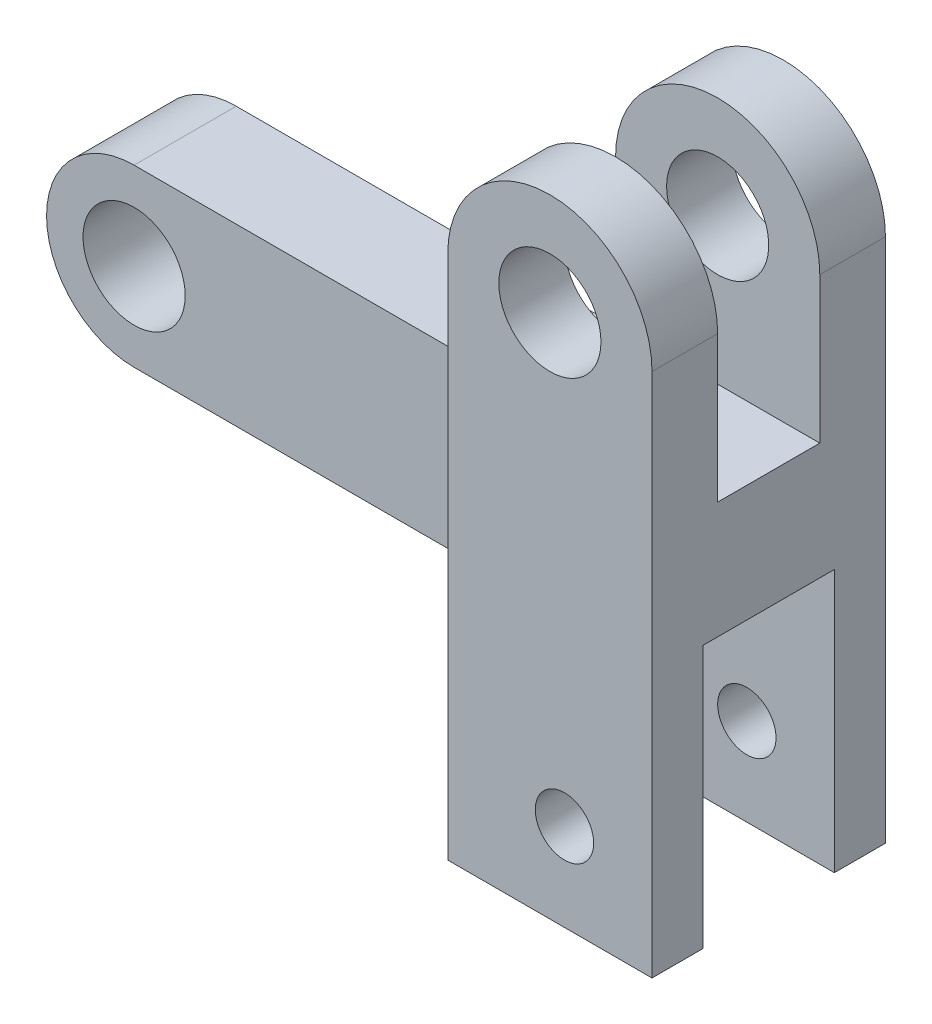
ISO-10303-21;
HEADER;
FILE_DESCRIPTION(('STEP AP214'),'2;1');
FILE_NAME('part.step','',(''),(''),'','','');
FILE_SCHEMA(('AUTOMOTIVE_DESIGN { 1 0 10303 214 1 1 1 1 }'));
ENDSEC;
DATA;
#1=APPLICATION_CONTEXT('core data for automotive mechanical design processes');
#2=APPLICATION_PROTOCOL_DEFINITION('international standard','automotive_design',2000,#1);
#3=PRODUCT_CONTEXT('',#1,'mechanical');
#4=PRODUCT('Part','Part','',(#3));
#5=PRODUCT_RELATED_PRODUCT_CATEGORY('part','',(#4));
#6=PRODUCT_DEFINITION_FORMATION('','',#4);
#7=PRODUCT_DEFINITION_CONTEXT('part definition',#1,'design');
#8=PRODUCT_DEFINITION('design','',#6,#7);
#9=PRODUCT_DEFINITION_SHAPE('','',#8);
#10=(LENGTH_UNIT() NAMED_UNIT(*) SI_UNIT(.MILLI.,.METRE.));
#11=(NAMED_UNIT(*) PLANE_ANGLE_UNIT() SI_UNIT($,.RADIAN.));
#12=(NAMED_UNIT(*) SI_UNIT($,.STERADIAN.) SOLID_ANGLE_UNIT());
#13=UNCERTAINTY_MEASURE_WITH_UNIT(LENGTH_MEASURE(1.E-05),#10,'distance_accuracy_value','');
#14=(GEOMETRIC_REPRESENTATION_CONTEXT(3) GLOBAL_UNCERTAINTY_ASSIGNED_CONTEXT((#13)) GLOBAL_UNIT_ASSIGNED_CONTEXT((#10,
#11,#12)) REPRESENTATION_CONTEXT('',''));
#15=CARTESIAN_POINT('',(0.,0.,0.));
#16=DIRECTION('',(0.,0.,1.));
#17=DIRECTION('',(1.,0.,0.));
#18=AXIS2_PLACEMENT_3D('',#15,#16,#17);
#19=CARTESIAN_POINT('',(0.,2.4,-3.5));
#20=DIRECTION('',(1.,0.,0.));
#21=DIRECTION('',(0.,0.,-1.));
#22=AXIS2_PLACEMENT_3D('',#19,#20,#21);
#23=PLANE('',#22);
#24=DIRECTION('',(0.,-1.,0.));
#25=VECTOR('',#24,1.);
#26=CARTESIAN_POINT('',(0.,1.,2.25));
#27=LINE('',#26,#25);
#28=CARTESIAN_POINT('',(0.,1.,2.25));
#29=VERTEX_POINT('',#28);
#30=CARTESIAN_POINT('',(0.,-8.,2.25));
#31=VERTEX_POINT('',#30);
#32=EDGE_CURVE('E239',#29,#31,#27,.T.);
#33=ORIENTED_EDGE('',*,*,#32,.T.);
#34=DIRECTION('',(0.,0.,-1.));
#35=VECTOR('',#34,1.);
#36=CARTESIAN_POINT('',(0.,-8.,3.5));
#37=LINE('',#36,#35);
#38=CARTESIAN_POINT('',(0.,-8.,4.));
#39=VERTEX_POINT('',#38);
#40=EDGE_CURVE('E278',#39,#31,#37,.T.);
#41=ORIENTED_EDGE('',*,*,#40,.F.);
#42=DIRECTION('',(0.,-1.,0.));
#43=VECTOR('',#42,1.);
#44=CARTESIAN_POINT('',(0.,10.,4.));
#45=LINE('',#44,#43);
#46=CARTESIAN_POINT('',(0.,10.,4.));
#47=VERTEX_POINT('',#46);
#48=EDGE_CURVE('E212',#47,#39,#45,.T.);
#49=ORIENTED_EDGE('',*,*,#48,.F.);
#50=DIRECTION('',(0.,0.,1.));
#51=VECTOR('',#50,1.);
#52=CARTESIAN_POINT('',(0.,10.,1.75));
#53=LINE('',#52,#51);
#54=CARTESIAN_POINT('',(0.,10.,1.75));
#55=VERTEX_POINT('',#54);
#56=EDGE_CURVE('E296',#55,#47,#53,.T.);
#57=ORIENTED_EDGE('',*,*,#56,.F.);
#58=DIRECTION('',(0.,1.,0.));
#59=VECTOR('',#58,1.);
#60=CARTESIAN_POINT('',(0.,0.,1.75));
#61=LINE('',#60,#59);
#62=CARTESIAN_POINT('',(0.,5.,1.75));
#63=VERTEX_POINT('',#62);
#64=EDGE_CURVE('E285',#63,#55,#61,.T.);
#65=ORIENTED_EDGE('',*,*,#64,.F.);
#66=CARTESIAN_POINT('',(0.,1.,1.75));
#67=VERTEX_POINT('',#66);
#68=EDGE_CURVE('E290',#67,#63,#61,.T.);
#69=ORIENTED_EDGE('',*,*,#68,.F.);
#70=DIRECTION('',(0.,0.,1.));
#71=VECTOR('',#70,1.);
#72=CARTESIAN_POINT('',(0.,1.,2.25));
#73=LINE('',#72,#71);
#74=EDGE_CURVE('E221',#67,#29,#73,.T.);
#75=ORIENTED_EDGE('',*,*,#74,.T.);
#76=EDGE_LOOP('',(#33,#41,#49,#57,#65,#69,#75));
#77=FACE_BOUND('',#76,.T.);
#78=ADVANCED_FACE('F45',(#77),#23,.F.);
#79=DIRECTION('',(0.,-1.,0.));
#80=VECTOR('',#79,1.);
#81=CARTESIAN_POINT('',(0.,1.,-2.25));
#82=LINE('',#81,#80);
#83=CARTESIAN_POINT('',(0.,1.,-2.25));
#84=VERTEX_POINT('',#83);
#85=CARTESIAN_POINT('',(0.,-8.,-2.25));
#86=VERTEX_POINT('',#85);
#87=EDGE_CURVE('E228',#84,#86,#82,.T.);
#88=ORIENTED_EDGE('',*,*,#87,.F.);
#89=CARTESIAN_POINT('',(0.,1.,-1.75));
#90=VERTEX_POINT('',#89);
#91=EDGE_CURVE('E216',#84,#90,#73,.T.);
#92=ORIENTED_EDGE('',*,*,#91,.T.);
#93=DIRECTION('',(0.,1.,0.));
#94=VECTOR('',#93,1.);
#95=CARTESIAN_POINT('',(0.,0.,-1.75));
#96=LINE('',#95,#94);
#97=CARTESIAN_POINT('',(0.,5.,-1.75));
#98=VERTEX_POINT('',#97);
#99=EDGE_CURVE('E301',#90,#98,#96,.T.);
#100=ORIENTED_EDGE('',*,*,#99,.T.);
#101=CARTESIAN_POINT('',(0.,10.,-1.75));
#102=VERTEX_POINT('',#101);
#103=EDGE_CURVE('E298',#98,#102,#96,.T.);
#104=ORIENTED_EDGE('',*,*,#103,.T.);
#105=DIRECTION('',(0.,0.,-1.));
#106=VECTOR('',#105,1.);
#107=CARTESIAN_POINT('',(0.,10.,-1.75));
#108=LINE('',#107,#106);
#109=CARTESIAN_POINT('',(0.,10.,-4.));
#110=VERTEX_POINT('',#109);
#111=EDGE_CURVE('E169',#102,#110,#108,.T.);
#112=ORIENTED_EDGE('',*,*,#111,.T.);
#113=DIRECTION('',(0.,1.,0.));
#114=VECTOR('',#113,1.);
#115=CARTESIAN_POINT('',(0.,-8.,-4.));
#116=LINE('',#115,#114);
#117=CARTESIAN_POINT('',(0.,-8.,-4.));
#118=VERTEX_POINT('',#117);
#119=EDGE_CURVE('E187',#118,#110,#116,.T.);
#120=ORIENTED_EDGE('',*,*,#119,.F.);
#121=EDGE_CURVE('E277',#86,#118,#37,.T.);
#122=ORIENTED_EDGE('',*,*,#121,.F.);
#123=EDGE_LOOP('',(#88,#92,#100,#104,#112,#120,#122));
#124=FACE_BOUND('',#123,.T.);
#125=ADVANCED_FACE('F368',(#124),#23,.F.);
#126=CARTESIAN_POINT('',(7.,2.4,-3.5));
#127=DIRECTION('',(-1.,0.,0.));
#128=DIRECTION('',(0.,0.,1.));
#129=AXIS2_PLACEMENT_3D('',#126,#127,#128);
#130=PLANE('',#129);
#131=DIRECTION('',(0.,-1.,0.));
#132=VECTOR('',#131,1.);
#133=CARTESIAN_POINT('',(7.,1.,2.25));
#134=LINE('',#133,#132);
#135=CARTESIAN_POINT('',(7.,1.,2.25));
#136=VERTEX_POINT('',#135);
#137=CARTESIAN_POINT('',(7.,-8.,2.25));
#138=VERTEX_POINT('',#137);
#139=EDGE_CURVE('E237',#136,#138,#134,.T.);
#140=ORIENTED_EDGE('',*,*,#139,.F.);
#141=DIRECTION('',(0.,0.,-1.));
#142=VECTOR('',#141,1.);
#143=CARTESIAN_POINT('',(7.,1.,2.25));
#144=LINE('',#143,#142);
#145=CARTESIAN_POINT('',(7.,1.,-2.25));
#146=VERTEX_POINT('',#145);
#147=EDGE_CURVE('E223',#136,#146,#144,.T.);
#148=ORIENTED_EDGE('',*,*,#147,.T.);
#149=DIRECTION('',(0.,-1.,0.));
#150=VECTOR('',#149,1.);
#151=CARTESIAN_POINT('',(7.,1.,-2.25));
#152=LINE('',#151,#150);
#153=CARTESIAN_POINT('',(7.,-8.,-2.25));
#154=VERTEX_POINT('',#153);
#155=EDGE_CURVE('E235',#146,#154,#152,.T.);
#156=ORIENTED_EDGE('',*,*,#155,.T.);
#157=DIRECTION('',(0.,0.,1.));
#158=VECTOR('',#157,1.);
#159=CARTESIAN_POINT('',(7.,-8.,-3.5));
#160=LINE('',#159,#158);
#161=CARTESIAN_POINT('',(7.,-8.,-4.));
#162=VERTEX_POINT('',#161);
#163=EDGE_CURVE('E177',#162,#154,#160,.T.);
#164=ORIENTED_EDGE('',*,*,#163,.F.);
#165=DIRECTION('',(0.,-1.,0.));
#166=VECTOR('',#165,1.);
#167=CARTESIAN_POINT('',(7.,10.,-4.));
#168=LINE('',#167,#166);
#169=CARTESIAN_POINT('',(7.,10.,-4.));
#170=VERTEX_POINT('',#169);
#171=EDGE_CURVE('E172',#170,#162,#168,.T.);
#172=ORIENTED_EDGE('',*,*,#171,.F.);
#173=DIRECTION('',(0.,0.,-1.));
#174=VECTOR('',#173,1.);
#175=CARTESIAN_POINT('',(7.,10.,-1.75));
#176=LINE('',#175,#174);
#177=CARTESIAN_POINT('',(7.,10.,-1.75));
#178=VERTEX_POINT('',#177);
#179=EDGE_CURVE('E53',#178,#170,#176,.T.);
#180=ORIENTED_EDGE('',*,*,#179,.F.);
#181=DIRECTION('',(0.,-1.,0.));
#182=VECTOR('',#181,1.);
#183=CARTESIAN_POINT('',(7.,0.,-1.75));
#184=LINE('',#183,#182);
#185=CARTESIAN_POINT('',(7.,5.,-1.75));
#186=VERTEX_POINT('',#185);
#187=EDGE_CURVE('E303',#178,#186,#184,.T.);
#188=ORIENTED_EDGE('',*,*,#187,.T.);
#189=DIRECTION('',(0.,0.,-1.));
#190=VECTOR('',#189,1.);
#191=CARTESIAN_POINT('',(7.,5.,1.75));
#192=LINE('',#191,#190);
#193=CARTESIAN_POINT('',(7.,5.,1.75));
#194=VERTEX_POINT('',#193);
#195=EDGE_CURVE('E269',#194,#186,#192,.T.);
#196=ORIENTED_EDGE('',*,*,#195,.F.);
#197=DIRECTION('',(0.,-1.,0.));
#198=VECTOR('',#197,1.);
#199=CARTESIAN_POINT('',(7.,0.,1.75));
#200=LINE('',#199,#198);
#201=CARTESIAN_POINT('',(7.,10.,1.75));
#202=VERTEX_POINT('',#201);
#203=EDGE_CURVE('E292',#202,#194,#200,.T.);
#204=ORIENTED_EDGE('',*,*,#203,.F.);
#205=DIRECTION('',(0.,0.,1.));
#206=VECTOR('',#205,1.);
#207=CARTESIAN_POINT('',(7.,10.,1.75));
#208=LINE('',#207,#206);
#209=CARTESIAN_POINT('',(7.,10.,4.));
#210=VERTEX_POINT('',#209);
#211=EDGE_CURVE('E294',#202,#210,#208,.T.);
#212=ORIENTED_EDGE('',*,*,#211,.T.);
#213=DIRECTION('',(0.,1.,0.));
#214=VECTOR('',#213,1.);
#215=CARTESIAN_POINT('',(7.,-8.,4.));
#216=LINE('',#215,#214);
#217=CARTESIAN_POINT('',(7.,-8.,4.));
#218=VERTEX_POINT('',#217);
#219=EDGE_CURVE('E206',#218,#210,#216,.T.);
#220=ORIENTED_EDGE('',*,*,#219,.F.);
#221=EDGE_CURVE('E275',#138,#218,#160,.T.);
#222=ORIENTED_EDGE('',*,*,#221,.F.);
#223=EDGE_LOOP('',(#140,#148,#156,#164,#172,#180,#188,#196,#204,#212,#220,#222));
#224=FACE_BOUND('',#223,.T.);
#225=ADVANCED_FACE('F174',(#224),#130,.F.);
#226=CARTESIAN_POINT('',(0.,-8.,0.));
#227=DIRECTION('',(0.,-1.,0.));
#228=DIRECTION('',(0.,0.,-1.));
#229=AXIS2_PLACEMENT_3D('',#226,#227,#228);
#230=PLANE('',#229);
#231=ORIENTED_EDGE('',*,*,#40,.T.);
#232=DIRECTION('',(1.,0.,0.));
#233=VECTOR('',#232,1.);
#234=CARTESIAN_POINT('',(0.,-8.,2.25));
#235=LINE('',#234,#233);
#236=EDGE_CURVE('E215',#31,#138,#235,.T.);
#237=ORIENTED_EDGE('',*,*,#236,.T.);
#238=ORIENTED_EDGE('',*,*,#221,.T.);
#239=DIRECTION('',(1.,0.,0.));
#240=VECTOR('',#239,1.);
#241=CARTESIAN_POINT('',(0.,-8.,4.));
#242=LINE('',#241,#240);
#243=EDGE_CURVE('E203',#39,#218,#242,.T.);
#244=ORIENTED_EDGE('',*,*,#243,.F.);
#245=EDGE_LOOP('',(#231,#237,#238,#244));
#246=FACE_BOUND('',#245,.T.);
#247=ADVANCED_FACE('F330',(#246),#230,.T.);
#248=ORIENTED_EDGE('',*,*,#163,.T.);
#249=DIRECTION('',(-1.,0.,0.));
#250=VECTOR('',#249,1.);
#251=CARTESIAN_POINT('',(0.,-8.,-2.25));
#252=LINE('',#251,#250);
#253=EDGE_CURVE('E231',#154,#86,#252,.T.);
#254=ORIENTED_EDGE('',*,*,#253,.T.);
#255=ORIENTED_EDGE('',*,*,#121,.T.);
#256=DIRECTION('',(-1.,0.,0.));
#257=VECTOR('',#256,1.);
#258=CARTESIAN_POINT('',(7.,-8.,-4.));
#259=LINE('',#258,#257);
#260=EDGE_CURVE('E181',#162,#118,#259,.T.);
#261=ORIENTED_EDGE('',*,*,#260,.F.);
#262=EDGE_LOOP('',(#248,#254,#255,#261));
#263=FACE_BOUND('',#262,.T.);
#264=ADVANCED_FACE('F379',(#263),#230,.T.);
#265=CARTESIAN_POINT('',(4.,-5.,-3.5));
#266=DIRECTION('',(0.,0.,1.));
#267=DIRECTION('',(1.,0.,0.));
#268=AXIS2_PLACEMENT_3D('',#265,#266,#267);
#269=CYLINDRICAL_SURFACE('',#268,1.);
#270=CARTESIAN_POINT('',(4.,-5.,2.25));
#271=DIRECTION('',(0.,0.,-1.));
#272=DIRECTION('',(-1.,0.,0.));
#273=AXIS2_PLACEMENT_3D('',#270,#271,#272);
#274=CIRCLE('',#273,1.);
#275=CARTESIAN_POINT('',(3.,-5.,2.25));
#276=VERTEX_POINT('',#275);
#277=EDGE_CURVE('E48',#276,#276,#274,.T.);
#278=ORIENTED_EDGE('',*,*,#277,.T.);
#279=EDGE_LOOP('',(#278));
#280=FACE_BOUND('',#279,.T.);
#281=CARTESIAN_POINT('',(4.,-5.,4.));
#282=DIRECTION('',(0.,0.,1.));
#283=DIRECTION('',(1.,0.,0.));
#284=AXIS2_PLACEMENT_3D('',#281,#282,#283);
#285=CIRCLE('',#284,1.);
#286=CARTESIAN_POINT('',(5.,-5.,4.));
#287=VERTEX_POINT('',#286);
#288=EDGE_CURVE('E200',#287,#287,#285,.T.);
#289=ORIENTED_EDGE('',*,*,#288,.T.);
#290=EDGE_LOOP('',(#289));
#291=FACE_BOUND('',#290,.T.);
#292=ADVANCED_FACE('F313',(#280,#291),#269,.F.);
#293=CARTESIAN_POINT('',(4.,-5.,-2.25));
#294=DIRECTION('',(0.,0.,1.));
#295=DIRECTION('',(1.,0.,0.));
#296=AXIS2_PLACEMENT_3D('',#293,#294,#295);
#297=CIRCLE('',#296,1.);
#298=CARTESIAN_POINT('',(5.,-5.,-2.25));
#299=VERTEX_POINT('',#298);
#300=EDGE_CURVE('E242',#299,#299,#297,.T.);
#301=ORIENTED_EDGE('',*,*,#300,.T.);
#302=EDGE_LOOP('',(#301));
#303=FACE_BOUND('',#302,.T.);
#304=CARTESIAN_POINT('',(4.,-5.,-4.));
#305=DIRECTION('',(0.,0.,-1.));
#306=DIRECTION('',(-1.,0.,0.));
#307=AXIS2_PLACEMENT_3D('',#304,#305,#306);
#308=CIRCLE('',#307,0.999999999999997);
#309=CARTESIAN_POINT('',(3.,-5.,-4.));
#310=VERTEX_POINT('',#309);
#311=EDGE_CURVE('E188',#310,#310,#308,.T.);
#312=ORIENTED_EDGE('',*,*,#311,.T.);
#313=EDGE_LOOP('',(#312));
#314=FACE_BOUND('',#313,.T.);
#315=ADVANCED_FACE('F387',(#303,#314),#269,.F.);
#316=CARTESIAN_POINT('',(3.5,10.,-1.75));
#317=DIRECTION('',(0.,0.,-1.));
#318=DIRECTION('',(-1.,0.,0.));
#319=AXIS2_PLACEMENT_3D('',#316,#317,#318);
#320=CYLINDRICAL_SURFACE('',#319,3.5);
#321=ORIENTED_EDGE('',*,*,#179,.T.);
#322=CARTESIAN_POINT('',(3.5,10.,-4.));
#323=DIRECTION('',(0.,0.,-1.));
#324=DIRECTION('',(-1.,0.,0.));
#325=AXIS2_PLACEMENT_3D('',#322,#323,#324);
#326=CIRCLE('',#325,3.5);
#327=EDGE_CURVE('E165',#110,#170,#326,.T.);
#328=ORIENTED_EDGE('',*,*,#327,.F.);
#329=ORIENTED_EDGE('',*,*,#111,.F.);
#330=CARTESIAN_POINT('',(3.5,10.,-1.75));
#331=DIRECTION('',(0.,0.,-1.));
#332=DIRECTION('',(-1.,0.,0.));
#333=AXIS2_PLACEMENT_3D('',#330,#331,#332);
#334=CIRCLE('',#333,3.5);
#335=EDGE_CURVE('E167',#102,#178,#334,.T.);
#336=ORIENTED_EDGE('',*,*,#335,.T.);
#337=EDGE_LOOP('',(#321,#328,#329,#336));
#338=FACE_BOUND('',#337,.T.);
#339=ADVANCED_FACE('F162',(#338),#320,.T.);
#340=CARTESIAN_POINT('',(0.,0.,-1.75));
#341=DIRECTION('',(0.,0.,-1.));
#342=DIRECTION('',(-1.,0.,0.));
#343=AXIS2_PLACEMENT_3D('',#340,#341,#342);
#344=PLANE('',#343);
#345=CARTESIAN_POINT('',(3.5,10.,-1.75));
#346=DIRECTION('',(0.,0.,-1.));
#347=DIRECTION('',(-1.,0.,0.));
#348=AXIS2_PLACEMENT_3D('',#345,#346,#347);
#349=CIRCLE('',#348,1.75);
#350=CARTESIAN_POINT('',(1.75,10.,-1.75));
#351=VERTEX_POINT('',#350);
#352=EDGE_CURVE('E282',#351,#351,#349,.T.);
#353=ORIENTED_EDGE('',*,*,#352,.T.);
#354=EDGE_LOOP('',(#353));
#355=FACE_BOUND('',#354,.T.);
#356=ORIENTED_EDGE('',*,*,#103,.F.);
#357=DIRECTION('',(1.,0.,0.));
#358=VECTOR('',#357,1.);
#359=CARTESIAN_POINT('',(0.,5.,-1.75));
#360=LINE('',#359,#358);
#361=EDGE_CURVE('E69',#98,#186,#360,.T.);
#362=ORIENTED_EDGE('',*,*,#361,.T.);
#363=ORIENTED_EDGE('',*,*,#187,.F.);
#364=ORIENTED_EDGE('',*,*,#335,.F.);
#365=EDGE_LOOP('',(#356,#362,#363,#364));
#366=FACE_BOUND('',#365,.T.);
#367=ADVANCED_FACE('F369',(#355,#366),#344,.F.);
#368=CARTESIAN_POINT('',(3.5,10.,1.75));
#369=DIRECTION('',(0.,0.,1.));
#370=DIRECTION('',(1.,0.,0.));
#371=AXIS2_PLACEMENT_3D('',#368,#369,#370);
#372=CYLINDRICAL_SURFACE('',#371,3.5);
#373=ORIENTED_EDGE('',*,*,#56,.T.);
#374=CARTESIAN_POINT('',(3.5,10.,4.));
#375=DIRECTION('',(0.,0.,1.));
#376=DIRECTION('',(1.,0.,0.));
#377=AXIS2_PLACEMENT_3D('',#374,#375,#376);
#378=CIRCLE('',#377,3.5);
#379=EDGE_CURVE('E209',#210,#47,#378,.T.);
#380=ORIENTED_EDGE('',*,*,#379,.F.);
#381=ORIENTED_EDGE('',*,*,#211,.F.);
#382=CARTESIAN_POINT('',(3.5,10.,1.75));
#383=DIRECTION('',(0.,0.,-1.));
#384=DIRECTION('',(-1.,0.,0.));
#385=AXIS2_PLACEMENT_3D('',#382,#383,#384);
#386=CIRCLE('',#385,3.5);
#387=EDGE_CURVE('E289',#55,#202,#386,.T.);
#388=ORIENTED_EDGE('',*,*,#387,.F.);
#389=EDGE_LOOP('',(#373,#380,#381,#388));
#390=FACE_BOUND('',#389,.T.);
#391=ADVANCED_FACE('F340',(#390),#372,.T.);
#392=CARTESIAN_POINT('',(0.,0.,1.75));
#393=DIRECTION('',(0.,0.,-1.));
#394=DIRECTION('',(-1.,0.,0.));
#395=AXIS2_PLACEMENT_3D('',#392,#393,#394);
#396=PLANE('',#395);
#397=DIRECTION('',(1.,0.,0.));
#398=VECTOR('',#397,1.);
#399=CARTESIAN_POINT('',(0.,5.,1.75));
#400=LINE('',#399,#398);
#401=EDGE_CURVE('E12',#63,#194,#400,.T.);
#402=ORIENTED_EDGE('',*,*,#401,.F.);
#403=ORIENTED_EDGE('',*,*,#64,.T.);
#404=ORIENTED_EDGE('',*,*,#387,.T.);
#405=ORIENTED_EDGE('',*,*,#203,.T.);
#406=EDGE_LOOP('',(#402,#403,#404,#405));
#407=FACE_BOUND('',#406,.T.);
#408=CARTESIAN_POINT('',(3.5,10.,1.75));
#409=DIRECTION('',(0.,0.,-1.));
#410=DIRECTION('',(-1.,0.,0.));
#411=AXIS2_PLACEMENT_3D('',#408,#409,#410);
#412=CIRCLE('',#411,1.75);
#413=CARTESIAN_POINT('',(1.75,10.,1.75));
#414=VERTEX_POINT('',#413);
#415=EDGE_CURVE('E281',#414,#414,#412,.T.);
#416=ORIENTED_EDGE('',*,*,#415,.F.);
#417=EDGE_LOOP('',(#416));
#418=FACE_BOUND('',#417,.T.);
#419=ADVANCED_FACE('F345',(#407,#418),#396,.T.);
#420=CARTESIAN_POINT('',(3.5,10.,3.5));
#421=DIRECTION('',(0.,0.,-1.));
#422=DIRECTION('',(-1.,0.,0.));
#423=AXIS2_PLACEMENT_3D('',#420,#421,#422);
#424=CYLINDRICAL_SURFACE('',#423,1.75);
#425=ORIENTED_EDGE('',*,*,#415,.T.);
#426=EDGE_LOOP('',(#425));
#427=FACE_BOUND('',#426,.T.);
#428=CARTESIAN_POINT('',(3.5,10.,4.));
#429=DIRECTION('',(0.,0.,1.));
#430=DIRECTION('',(1.,0.,0.));
#431=AXIS2_PLACEMENT_3D('',#428,#429,#430);
#432=CIRCLE('',#431,1.75);
#433=CARTESIAN_POINT('',(5.25,10.,4.));
#434=VERTEX_POINT('',#433);
#435=EDGE_CURVE('E197',#434,#434,#432,.T.);
#436=ORIENTED_EDGE('',*,*,#435,.T.);
#437=EDGE_LOOP('',(#436));
#438=FACE_BOUND('',#437,.T.);
#439=ADVANCED_FACE('F411',(#427,#438),#424,.F.);
#440=ORIENTED_EDGE('',*,*,#352,.F.);
#441=EDGE_LOOP('',(#440));
#442=FACE_BOUND('',#441,.T.);
#443=CARTESIAN_POINT('',(3.5,10.,-4.));
#444=DIRECTION('',(0.,0.,-1.));
#445=DIRECTION('',(-1.,0.,0.));
#446=AXIS2_PLACEMENT_3D('',#443,#444,#445);
#447=CIRCLE('',#446,1.75);
#448=CARTESIAN_POINT('',(1.75,10.,-4.));
#449=VERTEX_POINT('',#448);
#450=EDGE_CURVE('E191',#449,#449,#447,.T.);
#451=ORIENTED_EDGE('',*,*,#450,.T.);
#452=EDGE_LOOP('',(#451));
#453=FACE_BOUND('',#452,.T.);
#454=ADVANCED_FACE('F413',(#442,#453),#424,.F.);
#455=CARTESIAN_POINT('',(0.,-0.999999999999999,1.75));
#456=DIRECTION('',(0.,1.,0.));
#457=DIRECTION('',(-1.,0.,0.));
#458=AXIS2_PLACEMENT_3D('',#455,#456,#457);
#459=PLANE('',#458);
#460=DIRECTION('',(1.,0.,0.));
#461=VECTOR('',#460,1.);
#462=CARTESIAN_POINT('',(0.,-0.999999999999999,-1.75));
#463=LINE('',#462,#461);
#464=CARTESIAN_POINT('',(-13.,-1.,-1.75));
#465=VERTEX_POINT('',#464);
#466=CARTESIAN_POINT('',(0.,-1.,-1.75));
#467=VERTEX_POINT('',#466);
#468=EDGE_CURVE('E263',#465,#467,#463,.T.);
#469=ORIENTED_EDGE('',*,*,#468,.T.);
#470=DIRECTION('',(0.,0.,1.));
#471=VECTOR('',#470,1.);
#472=CARTESIAN_POINT('',(0.,-1.,-3.5));
#473=LINE('',#472,#471);
#474=CARTESIAN_POINT('',(0.,-0.999999999999999,1.75));
#475=VERTEX_POINT('',#474);
#476=EDGE_CURVE('E61',#467,#475,#473,.T.);
#477=ORIENTED_EDGE('',*,*,#476,.T.);
#478=DIRECTION('',(1.,0.,0.));
#479=VECTOR('',#478,1.);
#480=CARTESIAN_POINT('',(0.,-0.999999999999999,1.75));
#481=LINE('',#480,#479);
#482=CARTESIAN_POINT('',(-13.,-1.,1.75));
#483=VERTEX_POINT('',#482);
#484=EDGE_CURVE('E250',#483,#475,#481,.T.);
#485=ORIENTED_EDGE('',*,*,#484,.F.);
#486=DIRECTION('',(0.,0.,-1.));
#487=VECTOR('',#486,1.);
#488=CARTESIAN_POINT('',(-13.,-1.,1.75));
#489=LINE('',#488,#487);
#490=EDGE_CURVE('E272',#483,#465,#489,.T.);
#491=ORIENTED_EDGE('',*,*,#490,.T.);
#492=EDGE_LOOP('',(#469,#477,#485,#491));
#493=FACE_BOUND('',#492,.T.);
#494=ADVANCED_FACE('F355',(#493),#459,.F.);
#495=CARTESIAN_POINT('',(0.,0.,1.75));
#496=DIRECTION('',(0.,0.,1.));
#497=DIRECTION('',(1.,0.,0.));
#498=AXIS2_PLACEMENT_3D('',#495,#496,#497);
#499=PLANE('',#498);
#500=CARTESIAN_POINT('',(-13.,2.,1.75));
#501=DIRECTION('',(0.,0.,1.));
#502=DIRECTION('',(1.,0.,0.));
#503=AXIS2_PLACEMENT_3D('',#500,#501,#502);
#504=CIRCLE('',#503,1.75);
#505=CARTESIAN_POINT('',(-11.25,2.,1.75));
#506=VERTEX_POINT('',#505);
#507=EDGE_CURVE('E243',#506,#506,#504,.T.);
#508=ORIENTED_EDGE('',*,*,#507,.F.);
#509=EDGE_LOOP('',(#508));
#510=FACE_BOUND('',#509,.T.);
#511=EDGE_CURVE('E286',#475,#67,#61,.T.);
#512=ORIENTED_EDGE('',*,*,#511,.T.);
#513=ORIENTED_EDGE('',*,*,#68,.T.);
#514=DIRECTION('',(1.,0.,0.));
#515=VECTOR('',#514,1.);
#516=CARTESIAN_POINT('',(0.,5.,1.75));
#517=LINE('',#516,#515);
#518=CARTESIAN_POINT('',(-13.,5.,1.75));
#519=VERTEX_POINT('',#518);
#520=EDGE_CURVE('E253',#519,#63,#517,.T.);
#521=ORIENTED_EDGE('',*,*,#520,.F.);
#522=CARTESIAN_POINT('',(-13.,2.,1.75));
#523=DIRECTION('',(0.,0.,1.));
#524=DIRECTION('',(1.,0.,0.));
#525=AXIS2_PLACEMENT_3D('',#522,#523,#524);
#526=CIRCLE('',#525,3.);
#527=EDGE_CURVE('E246',#483,#519,#526,.F.);
#528=ORIENTED_EDGE('',*,*,#527,.F.);
#529=ORIENTED_EDGE('',*,*,#484,.T.);
#530=EDGE_LOOP('',(#512,#513,#521,#528,#529));
#531=FACE_BOUND('',#530,.T.);
#532=ADVANCED_FACE('F349',(#510,#531),#499,.T.);
#533=CARTESIAN_POINT('',(0.,0.,-1.75));
#534=DIRECTION('',(0.,0.,1.));
#535=DIRECTION('',(1.,0.,0.));
#536=AXIS2_PLACEMENT_3D('',#533,#534,#535);
#537=PLANE('',#536);
#538=CARTESIAN_POINT('',(-13.,2.,-1.75));
#539=DIRECTION('',(0.,0.,1.));
#540=DIRECTION('',(1.,0.,0.));
#541=AXIS2_PLACEMENT_3D('',#538,#539,#540);
#542=CIRCLE('',#541,1.75);
#543=CARTESIAN_POINT('',(-11.25,2.,-1.75));
#544=VERTEX_POINT('',#543);
#545=EDGE_CURVE('E257',#544,#544,#542,.T.);
#546=ORIENTED_EDGE('',*,*,#545,.T.);
#547=EDGE_LOOP('',(#546));
#548=FACE_BOUND('',#547,.T.);
#549=CARTESIAN_POINT('',(-13.,5.,-1.75));
#550=VERTEX_POINT('',#549);
#551=EDGE_CURVE('E247',#550,#98,#360,.T.);
#552=ORIENTED_EDGE('',*,*,#551,.T.);
#553=ORIENTED_EDGE('',*,*,#99,.F.);
#554=EDGE_CURVE('E299',#467,#90,#96,.T.);
#555=ORIENTED_EDGE('',*,*,#554,.F.);
#556=ORIENTED_EDGE('',*,*,#468,.F.);
#557=CARTESIAN_POINT('',(-13.,2.,-1.75));
#558=DIRECTION('',(0.,0.,1.));
#559=DIRECTION('',(1.,0.,0.));
#560=AXIS2_PLACEMENT_3D('',#557,#558,#559);
#561=CIRCLE('',#560,3.);
#562=EDGE_CURVE('E260',#465,#550,#561,.F.);
#563=ORIENTED_EDGE('',*,*,#562,.T.);
#564=EDGE_LOOP('',(#552,#553,#555,#556,#563));
#565=FACE_BOUND('',#564,.T.);
#566=ADVANCED_FACE('F359',(#548,#565),#537,.F.);
#567=CARTESIAN_POINT('',(-13.,2.,1.75));
#568=DIRECTION('',(0.,0.,-1.));
#569=DIRECTION('',(-1.,0.,0.));
#570=AXIS2_PLACEMENT_3D('',#567,#568,#569);
#571=CYLINDRICAL_SURFACE('',#570,3.);
#572=ORIENTED_EDGE('',*,*,#562,.F.);
#573=ORIENTED_EDGE('',*,*,#490,.F.);
#574=ORIENTED_EDGE('',*,*,#527,.T.);
#575=DIRECTION('',(0.,0.,-1.));
#576=VECTOR('',#575,1.);
#577=CARTESIAN_POINT('',(-13.,5.,1.75));
#578=LINE('',#577,#576);
#579=EDGE_CURVE('E256',#519,#550,#578,.T.);
#580=ORIENTED_EDGE('',*,*,#579,.T.);
#581=EDGE_LOOP('',(#572,#573,#574,#580));
#582=FACE_BOUND('',#581,.T.);
#583=ADVANCED_FACE('F363',(#582),#571,.T.);
#584=CARTESIAN_POINT('',(-13.,2.,1.75));
#585=DIRECTION('',(0.,0.,-1.));
#586=DIRECTION('',(-1.,0.,0.));
#587=AXIS2_PLACEMENT_3D('',#584,#585,#586);
#588=CYLINDRICAL_SURFACE('',#587,1.75);
#589=ORIENTED_EDGE('',*,*,#507,.T.);
#590=EDGE_LOOP('',(#589));
#591=FACE_BOUND('',#590,.T.);
#592=ORIENTED_EDGE('',*,*,#545,.F.);
#593=EDGE_LOOP('',(#592));
#594=FACE_BOUND('',#593,.T.);
#595=ADVANCED_FACE('F445',(#591,#594),#588,.F.);
#596=CARTESIAN_POINT('',(0.,5.,1.75));
#597=DIRECTION('',(0.,1.,0.));
#598=DIRECTION('',(0.,0.,1.));
#599=AXIS2_PLACEMENT_3D('',#596,#597,#598);
#600=PLANE('',#599);
#601=ORIENTED_EDGE('',*,*,#551,.F.);
#602=ORIENTED_EDGE('',*,*,#579,.F.);
#603=ORIENTED_EDGE('',*,*,#520,.T.);
#604=ORIENTED_EDGE('',*,*,#401,.T.);
#605=ORIENTED_EDGE('',*,*,#195,.T.);
#606=ORIENTED_EDGE('',*,*,#361,.F.);
#607=EDGE_LOOP('',(#601,#602,#603,#604,#605,#606));
#608=FACE_BOUND('',#607,.T.);
#609=ADVANCED_FACE('F365',(#608),#600,.T.);
#610=CARTESIAN_POINT('',(0.,1.,2.25));
#611=DIRECTION('',(1.,0.,0.));
#612=DIRECTION('',(0.,0.,-1.));
#613=AXIS2_PLACEMENT_3D('',#610,#611,#612);
#614=PLANE('',#613);
#615=ORIENTED_EDGE('',*,*,#476,.F.);
#616=ORIENTED_EDGE('',*,*,#554,.T.);
#617=EDGE_CURVE('E220',#90,#67,#73,.T.);
#618=ORIENTED_EDGE('',*,*,#617,.T.);
#619=ORIENTED_EDGE('',*,*,#511,.F.);
#620=EDGE_LOOP('',(#615,#616,#618,#619));
#621=FACE_BOUND('',#620,.T.);
#622=ADVANCED_FACE('F320',(#621),#614,.T.);
#623=CARTESIAN_POINT('',(0.,1.,2.25));
#624=DIRECTION('',(0.,0.,-1.));
#625=DIRECTION('',(-1.,0.,0.));
#626=AXIS2_PLACEMENT_3D('',#623,#624,#625);
#627=PLANE('',#626);
#628=ORIENTED_EDGE('',*,*,#277,.F.);
#629=EDGE_LOOP('',(#628));
#630=FACE_BOUND('',#629,.T.);
#631=ORIENTED_EDGE('',*,*,#236,.F.);
#632=ORIENTED_EDGE('',*,*,#32,.F.);
#633=DIRECTION('',(1.,0.,0.));
#634=VECTOR('',#633,1.);
#635=CARTESIAN_POINT('',(0.,1.,2.25));
#636=LINE('',#635,#634);
#637=EDGE_CURVE('E219',#29,#136,#636,.T.);
#638=ORIENTED_EDGE('',*,*,#637,.T.);
#639=ORIENTED_EDGE('',*,*,#139,.T.);
#640=EDGE_LOOP('',(#631,#632,#638,#639));
#641=FACE_BOUND('',#640,.T.);
#642=ADVANCED_FACE('F316',(#630,#641),#627,.T.);
#643=CARTESIAN_POINT('',(0.,1.,-2.25));
#644=DIRECTION('',(0.,0.,1.));
#645=DIRECTION('',(1.,0.,0.));
#646=AXIS2_PLACEMENT_3D('',#643,#644,#645);
#647=PLANE('',#646);
#648=ORIENTED_EDGE('',*,*,#300,.F.);
#649=EDGE_LOOP('',(#648));
#650=FACE_BOUND('',#649,.T.);
#651=ORIENTED_EDGE('',*,*,#253,.F.);
#652=ORIENTED_EDGE('',*,*,#155,.F.);
#653=DIRECTION('',(-1.,0.,0.));
#654=VECTOR('',#653,1.);
#655=CARTESIAN_POINT('',(0.,1.,-2.25));
#656=LINE('',#655,#654);
#657=EDGE_CURVE('E226',#146,#84,#656,.T.);
#658=ORIENTED_EDGE('',*,*,#657,.T.);
#659=ORIENTED_EDGE('',*,*,#87,.T.);
#660=EDGE_LOOP('',(#651,#652,#658,#659));
#661=FACE_BOUND('',#660,.T.);
#662=ADVANCED_FACE('F319',(#650,#661),#647,.T.);
#663=CARTESIAN_POINT('',(0.,1.,0.));
#664=DIRECTION('',(0.,-1.,0.));
#665=DIRECTION('',(0.,0.,-1.));
#666=AXIS2_PLACEMENT_3D('',#663,#664,#665);
#667=PLANE('',#666);
#668=ORIENTED_EDGE('',*,*,#91,.F.);
#669=ORIENTED_EDGE('',*,*,#657,.F.);
#670=ORIENTED_EDGE('',*,*,#147,.F.);
#671=ORIENTED_EDGE('',*,*,#637,.F.);
#672=ORIENTED_EDGE('',*,*,#74,.F.);
#673=ORIENTED_EDGE('',*,*,#617,.F.);
#674=EDGE_LOOP('',(#668,#669,#670,#671,#672,#673));
#675=FACE_BOUND('',#674,.T.);
#676=ADVANCED_FACE('F375',(#675),#667,.T.);
#677=CARTESIAN_POINT('',(3.5,10.,4.));
#678=DIRECTION('',(0.,0.,1.));
#679=DIRECTION('',(1.,0.,0.));
#680=AXIS2_PLACEMENT_3D('',#677,#678,#679);
#681=PLANE('',#680);
#682=ORIENTED_EDGE('',*,*,#288,.F.);
#683=EDGE_LOOP('',(#682));
#684=FACE_BOUND('',#683,.T.);
#685=ORIENTED_EDGE('',*,*,#243,.T.);
#686=ORIENTED_EDGE('',*,*,#219,.T.);
#687=ORIENTED_EDGE('',*,*,#379,.T.);
#688=ORIENTED_EDGE('',*,*,#48,.T.);
#689=EDGE_LOOP('',(#685,#686,#687,#688));
#690=FACE_BOUND('',#689,.T.);
#691=ORIENTED_EDGE('',*,*,#435,.F.);
#692=EDGE_LOOP('',(#691));
#693=FACE_BOUND('',#692,.T.);
#694=ADVANCED_FACE('F333',(#684,#690,#693),#681,.T.);
#695=CARTESIAN_POINT('',(3.5,10.,-4.));
#696=DIRECTION('',(0.,0.,-1.));
#697=DIRECTION('',(-1.,0.,0.));
#698=AXIS2_PLACEMENT_3D('',#695,#696,#697);
#699=PLANE('',#698);
#700=ORIENTED_EDGE('',*,*,#311,.F.);
#701=EDGE_LOOP('',(#700));
#702=FACE_BOUND('',#701,.T.);
#703=ORIENTED_EDGE('',*,*,#327,.T.);
#704=ORIENTED_EDGE('',*,*,#171,.T.);
#705=ORIENTED_EDGE('',*,*,#260,.T.);
#706=ORIENTED_EDGE('',*,*,#119,.T.);
#707=EDGE_LOOP('',(#703,#704,#705,#706));
#708=FACE_BOUND('',#707,.T.);
#709=ORIENTED_EDGE('',*,*,#450,.F.);
#710=EDGE_LOOP('',(#709));
#711=FACE_BOUND('',#710,.T.);
#712=ADVANCED_FACE('F184',(#702,#708,#711),#699,.T.);
#713=CLOSED_SHELL('',(#78,#125,#225,#247,#264,#292,#315,#339,#367,#391,#419,#439,#454,#494,#532,
#566,#583,#595,#609,#622,#642,#662,#676,#694,#712));
#714=MANIFOLD_SOLID_BREP('B2',#713);
#715=ADVANCED_BREP_SHAPE_REPRESENTATION('',(#18,#714),#14);
#716=SHAPE_DEFINITION_REPRESENTATION(#9,#715);
ENDSEC;
END-ISO-10303-21;
